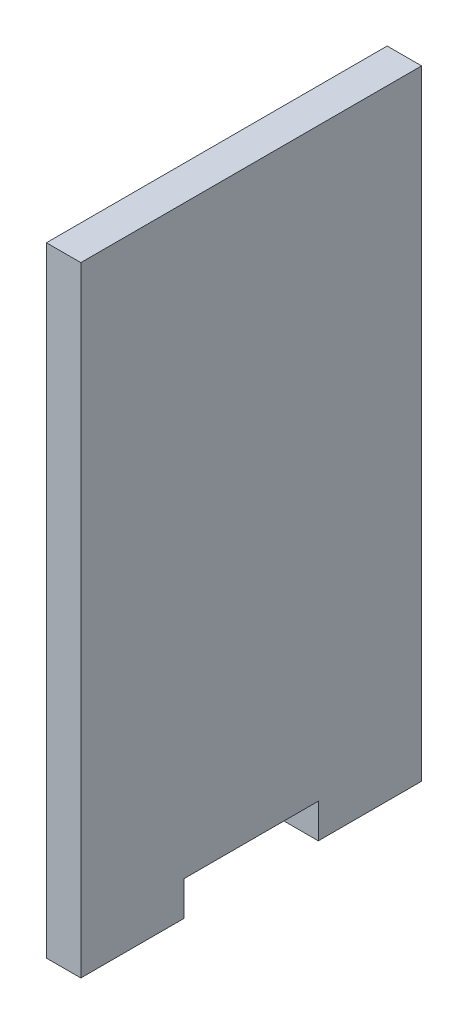
ISO-10303-21;
HEADER;
FILE_DESCRIPTION(('STEP AP214'),'2;1');
FILE_NAME('part.step','',(''),(''),'','','');
FILE_SCHEMA(('AUTOMOTIVE_DESIGN { 1 0 10303 214 1 1 1 1 }'));
ENDSEC;
DATA;
#1=APPLICATION_CONTEXT('core data for automotive mechanical design processes');
#2=APPLICATION_PROTOCOL_DEFINITION('international standard','automotive_design',2000,#1);
#3=PRODUCT_CONTEXT('',#1,'mechanical');
#4=PRODUCT('Part','Part','',(#3));
#5=PRODUCT_RELATED_PRODUCT_CATEGORY('part','',(#4));
#6=PRODUCT_DEFINITION_FORMATION('','',#4);
#7=PRODUCT_DEFINITION_CONTEXT('part definition',#1,'design');
#8=PRODUCT_DEFINITION('design','',#6,#7);
#9=PRODUCT_DEFINITION_SHAPE('','',#8);
#10=(LENGTH_UNIT() NAMED_UNIT(*) SI_UNIT(.MILLI.,.METRE.));
#11=(NAMED_UNIT(*) PLANE_ANGLE_UNIT() SI_UNIT($,.RADIAN.));
#12=(NAMED_UNIT(*) SI_UNIT($,.STERADIAN.) SOLID_ANGLE_UNIT());
#13=UNCERTAINTY_MEASURE_WITH_UNIT(LENGTH_MEASURE(1.E-05),#10,'distance_accuracy_value','');
#14=(GEOMETRIC_REPRESENTATION_CONTEXT(3) GLOBAL_UNCERTAINTY_ASSIGNED_CONTEXT((#13)) GLOBAL_UNIT_ASSIGNED_CONTEXT((#10,
#11,#12)) REPRESENTATION_CONTEXT('',''));
#15=CARTESIAN_POINT('',(0.,0.,0.));
#16=DIRECTION('',(0.,0.,1.));
#17=DIRECTION('',(1.,0.,0.));
#18=AXIS2_PLACEMENT_3D('',#15,#16,#17);
#19=CARTESIAN_POINT('',(5.,43.2670104469725,0.));
#20=DIRECTION('',(0.,0.,-1.));
#21=DIRECTION('',(0.,1.,0.));
#22=AXIS2_PLACEMENT_3D('',#19,#20,#21);
#23=PLANE('',#22);
#24=DIRECTION('',(0.,-1.,0.));
#25=VECTOR('',#24,1.);
#26=CARTESIAN_POINT('',(0.,43.2670104469725,0.));
#27=LINE('',#26,#25);
#28=CARTESIAN_POINT('',(0.,43.2670104469725,0.));
#29=VERTEX_POINT('',#28);
#30=CARTESIAN_POINT('',(0.,-46.7329895530275,0.));
#31=VERTEX_POINT('',#30);
#32=EDGE_CURVE('E103',#29,#31,#27,.T.);
#33=ORIENTED_EDGE('',*,*,#32,.T.);
#34=DIRECTION('',(1.,0.,0.));
#35=VECTOR('',#34,1.);
#36=CARTESIAN_POINT('',(0.,-46.7329895530275,0.));
#37=LINE('',#36,#35);
#38=CARTESIAN_POINT('',(5.,-46.7329895530275,0.));
#39=VERTEX_POINT('',#38);
#40=EDGE_CURVE('E106',#31,#39,#37,.T.);
#41=ORIENTED_EDGE('',*,*,#40,.T.);
#42=DIRECTION('',(0.,-1.,0.));
#43=VECTOR('',#42,1.);
#44=CARTESIAN_POINT('',(5.,43.2670104469725,0.));
#45=LINE('',#44,#43);
#46=CARTESIAN_POINT('',(5.,43.2670104469725,0.));
#47=VERTEX_POINT('',#46);
#48=EDGE_CURVE('E151',#47,#39,#45,.T.);
#49=ORIENTED_EDGE('',*,*,#48,.F.);
#50=DIRECTION('',(-1.,0.,0.));
#51=VECTOR('',#50,1.);
#52=CARTESIAN_POINT('',(5.,43.2670104469725,0.));
#53=LINE('',#52,#51);
#54=EDGE_CURVE('E44',#47,#29,#53,.T.);
#55=ORIENTED_EDGE('',*,*,#54,.T.);
#56=EDGE_LOOP('',(#33,#41,#49,#55));
#57=FACE_BOUND('',#56,.T.);
#58=ADVANCED_FACE('F35',(#57),#23,.F.);
#59=CARTESIAN_POINT('',(5.,-41.7329895530275,0.));
#60=DIRECTION('',(0.,1.,0.));
#61=DIRECTION('',(0.,0.,1.));
#62=AXIS2_PLACEMENT_3D('',#59,#60,#61);
#63=PLANE('',#62);
#64=DIRECTION('',(0.,0.,-1.));
#65=VECTOR('',#64,1.);
#66=CARTESIAN_POINT('',(5.,-41.7329895530275,0.));
#67=LINE('',#66,#65);
#68=CARTESIAN_POINT('',(5.,-41.7329895530275,-15.));
#69=VERTEX_POINT('',#68);
#70=CARTESIAN_POINT('',(5.,-41.7329895530275,-34.5));
#71=VERTEX_POINT('',#70);
#72=EDGE_CURVE('E38',#69,#71,#67,.T.);
#73=ORIENTED_EDGE('',*,*,#72,.F.);
#74=DIRECTION('',(1.,0.,0.));
#75=VECTOR('',#74,1.);
#76=CARTESIAN_POINT('',(0.,-41.7329895530275,-15.));
#77=LINE('',#76,#75);
#78=CARTESIAN_POINT('',(0.,-41.7329895530275,-15.));
#79=VERTEX_POINT('',#78);
#80=EDGE_CURVE('E133',#79,#69,#77,.T.);
#81=ORIENTED_EDGE('',*,*,#80,.F.);
#82=DIRECTION('',(0.,0.,-1.));
#83=VECTOR('',#82,1.);
#84=CARTESIAN_POINT('',(0.,-41.7329895530275,0.));
#85=LINE('',#84,#83);
#86=CARTESIAN_POINT('',(0.,-41.7329895530275,-34.5));
#87=VERTEX_POINT('',#86);
#88=EDGE_CURVE('E112',#79,#87,#85,.T.);
#89=ORIENTED_EDGE('',*,*,#88,.T.);
#90=DIRECTION('',(1.,0.,0.));
#91=VECTOR('',#90,1.);
#92=CARTESIAN_POINT('',(0.,-41.7329895530275,-34.5));
#93=LINE('',#92,#91);
#94=EDGE_CURVE('E140',#87,#71,#93,.T.);
#95=ORIENTED_EDGE('',*,*,#94,.T.);
#96=EDGE_LOOP('',(#73,#81,#89,#95));
#97=FACE_BOUND('',#96,.T.);
#98=ADVANCED_FACE('F188',(#97),#63,.F.);
#99=CARTESIAN_POINT('',(5.,43.2670104469725,-49.5));
#100=DIRECTION('',(0.,0.,1.));
#101=DIRECTION('',(0.,-1.,0.));
#102=AXIS2_PLACEMENT_3D('',#99,#100,#101);
#103=PLANE('',#102);
#104=DIRECTION('',(0.,1.,0.));
#105=VECTOR('',#104,1.);
#106=CARTESIAN_POINT('',(0.,43.2670104469725,-49.5));
#107=LINE('',#106,#105);
#108=CARTESIAN_POINT('',(0.,-46.7329895530275,-49.5));
#109=VERTEX_POINT('',#108);
#110=CARTESIAN_POINT('',(0.,43.2670104469725,-49.5));
#111=VERTEX_POINT('',#110);
#112=EDGE_CURVE('E161',#109,#111,#107,.T.);
#113=ORIENTED_EDGE('',*,*,#112,.T.);
#114=DIRECTION('',(-1.,0.,0.));
#115=VECTOR('',#114,1.);
#116=CARTESIAN_POINT('',(5.,43.2670104469725,-49.5));
#117=LINE('',#116,#115);
#118=CARTESIAN_POINT('',(5.,43.2670104469725,-49.5));
#119=VERTEX_POINT('',#118);
#120=EDGE_CURVE('E11',#119,#111,#117,.T.);
#121=ORIENTED_EDGE('',*,*,#120,.F.);
#122=DIRECTION('',(0.,1.,0.));
#123=VECTOR('',#122,1.);
#124=CARTESIAN_POINT('',(5.,43.2670104469725,-49.5));
#125=LINE('',#124,#123);
#126=CARTESIAN_POINT('',(5.,-46.7329895530275,-49.5));
#127=VERTEX_POINT('',#126);
#128=EDGE_CURVE('E180',#127,#119,#125,.T.);
#129=ORIENTED_EDGE('',*,*,#128,.F.);
#130=DIRECTION('',(1.,0.,0.));
#131=VECTOR('',#130,1.);
#132=CARTESIAN_POINT('',(0.,-46.7329895530275,-49.5));
#133=LINE('',#132,#131);
#134=EDGE_CURVE('E113',#109,#127,#133,.T.);
#135=ORIENTED_EDGE('',*,*,#134,.F.);
#136=EDGE_LOOP('',(#113,#121,#129,#135));
#137=FACE_BOUND('',#136,.T.);
#138=ADVANCED_FACE('F178',(#137),#103,.F.);
#139=CARTESIAN_POINT('',(5.,43.2670104469725,0.));
#140=DIRECTION('',(0.,-1.,0.));
#141=DIRECTION('',(0.,0.,-1.));
#142=AXIS2_PLACEMENT_3D('',#139,#140,#141);
#143=PLANE('',#142);
#144=DIRECTION('',(0.,0.,1.));
#145=VECTOR('',#144,1.);
#146=CARTESIAN_POINT('',(0.,43.2670104469725,0.));
#147=LINE('',#146,#145);
#148=EDGE_CURVE('E166',#111,#29,#147,.T.);
#149=ORIENTED_EDGE('',*,*,#148,.T.);
#150=ORIENTED_EDGE('',*,*,#54,.F.);
#151=DIRECTION('',(0.,0.,1.));
#152=VECTOR('',#151,1.);
#153=CARTESIAN_POINT('',(5.,43.2670104469725,0.));
#154=LINE('',#153,#152);
#155=EDGE_CURVE('E168',#119,#47,#154,.T.);
#156=ORIENTED_EDGE('',*,*,#155,.F.);
#157=ORIENTED_EDGE('',*,*,#120,.T.);
#158=EDGE_LOOP('',(#149,#150,#156,#157));
#159=FACE_BOUND('',#158,.T.);
#160=ADVANCED_FACE('F185',(#159),#143,.F.);
#161=CARTESIAN_POINT('',(5.,0.,0.));
#162=DIRECTION('',(1.,0.,0.));
#163=DIRECTION('',(0.,0.,-1.));
#164=AXIS2_PLACEMENT_3D('',#161,#162,#163);
#165=PLANE('',#164);
#166=ORIENTED_EDGE('',*,*,#48,.T.);
#167=DIRECTION('',(0.,0.,-1.));
#168=VECTOR('',#167,1.);
#169=CARTESIAN_POINT('',(5.,-46.7329895530275,0.));
#170=LINE('',#169,#168);
#171=CARTESIAN_POINT('',(5.,-46.7329895530275,-15.));
#172=VERTEX_POINT('',#171);
#173=EDGE_CURVE('E120',#39,#172,#170,.T.);
#174=ORIENTED_EDGE('',*,*,#173,.T.);
#175=DIRECTION('',(0.,1.,0.));
#176=VECTOR('',#175,1.);
#177=CARTESIAN_POINT('',(5.,-41.7329895530275,-15.));
#178=LINE('',#177,#176);
#179=EDGE_CURVE('E127',#172,#69,#178,.T.);
#180=ORIENTED_EDGE('',*,*,#179,.T.);
#181=ORIENTED_EDGE('',*,*,#72,.T.);
#182=DIRECTION('',(0.,-1.,0.));
#183=VECTOR('',#182,1.);
#184=CARTESIAN_POINT('',(5.,-41.7329895530275,-34.5));
#185=LINE('',#184,#183);
#186=CARTESIAN_POINT('',(5.,-46.7329895530275,-34.5));
#187=VERTEX_POINT('',#186);
#188=EDGE_CURVE('E135',#71,#187,#185,.T.);
#189=ORIENTED_EDGE('',*,*,#188,.T.);
#190=DIRECTION('',(0.,0.,-1.));
#191=VECTOR('',#190,1.);
#192=CARTESIAN_POINT('',(5.,-46.7329895530275,-49.5));
#193=LINE('',#192,#191);
#194=EDGE_CURVE('E142',#187,#127,#193,.T.);
#195=ORIENTED_EDGE('',*,*,#194,.T.);
#196=ORIENTED_EDGE('',*,*,#128,.T.);
#197=ORIENTED_EDGE('',*,*,#155,.T.);
#198=EDGE_LOOP('',(#166,#174,#180,#181,#189,#195,#196,#197));
#199=FACE_BOUND('',#198,.T.);
#200=ADVANCED_FACE('F170',(#199),#165,.T.);
#201=CARTESIAN_POINT('',(0.,0.,0.));
#202=DIRECTION('',(1.,0.,0.));
#203=DIRECTION('',(0.,0.,-1.));
#204=AXIS2_PLACEMENT_3D('',#201,#202,#203);
#205=PLANE('',#204);
#206=ORIENTED_EDGE('',*,*,#32,.F.);
#207=ORIENTED_EDGE('',*,*,#148,.F.);
#208=ORIENTED_EDGE('',*,*,#112,.F.);
#209=DIRECTION('',(0.,0.,-1.));
#210=VECTOR('',#209,1.);
#211=CARTESIAN_POINT('',(0.,-46.7329895530275,-49.5));
#212=LINE('',#211,#210);
#213=CARTESIAN_POINT('',(0.,-46.7329895530275,-34.5));
#214=VERTEX_POINT('',#213);
#215=EDGE_CURVE('E137',#214,#109,#212,.T.);
#216=ORIENTED_EDGE('',*,*,#215,.F.);
#217=DIRECTION('',(0.,-1.,0.));
#218=VECTOR('',#217,1.);
#219=CARTESIAN_POINT('',(0.,-41.7329895530275,-34.5));
#220=LINE('',#219,#218);
#221=EDGE_CURVE('E141',#87,#214,#220,.T.);
#222=ORIENTED_EDGE('',*,*,#221,.F.);
#223=ORIENTED_EDGE('',*,*,#88,.F.);
#224=DIRECTION('',(0.,1.,0.));
#225=VECTOR('',#224,1.);
#226=CARTESIAN_POINT('',(0.,-41.7329895530275,-15.));
#227=LINE('',#226,#225);
#228=CARTESIAN_POINT('',(0.,-46.7329895530275,-15.));
#229=VERTEX_POINT('',#228);
#230=EDGE_CURVE('E122',#229,#79,#227,.T.);
#231=ORIENTED_EDGE('',*,*,#230,.F.);
#232=DIRECTION('',(0.,0.,-1.));
#233=VECTOR('',#232,1.);
#234=CARTESIAN_POINT('',(0.,-46.7329895530275,0.));
#235=LINE('',#234,#233);
#236=EDGE_CURVE('E118',#31,#229,#235,.T.);
#237=ORIENTED_EDGE('',*,*,#236,.F.);
#238=EDGE_LOOP('',(#206,#207,#208,#216,#222,#223,#231,#237));
#239=FACE_BOUND('',#238,.T.);
#240=ADVANCED_FACE('F125',(#239),#205,.F.);
#241=CARTESIAN_POINT('',(0.,-46.7329895530275,-49.5));
#242=DIRECTION('',(0.,-1.,0.));
#243=DIRECTION('',(0.,0.,-1.));
#244=AXIS2_PLACEMENT_3D('',#241,#242,#243);
#245=PLANE('',#244);
#246=ORIENTED_EDGE('',*,*,#194,.F.);
#247=DIRECTION('',(1.,0.,0.));
#248=VECTOR('',#247,1.);
#249=CARTESIAN_POINT('',(0.,-46.7329895530275,-34.5));
#250=LINE('',#249,#248);
#251=EDGE_CURVE('E147',#214,#187,#250,.T.);
#252=ORIENTED_EDGE('',*,*,#251,.F.);
#253=ORIENTED_EDGE('',*,*,#215,.T.);
#254=ORIENTED_EDGE('',*,*,#134,.T.);
#255=EDGE_LOOP('',(#246,#252,#253,#254));
#256=FACE_BOUND('',#255,.T.);
#257=ADVANCED_FACE('F174',(#256),#245,.T.);
#258=CARTESIAN_POINT('',(0.,-41.7329895530275,-34.5));
#259=DIRECTION('',(0.,0.,1.));
#260=DIRECTION('',(1.,0.,0.));
#261=AXIS2_PLACEMENT_3D('',#258,#259,#260);
#262=PLANE('',#261);
#263=ORIENTED_EDGE('',*,*,#188,.F.);
#264=ORIENTED_EDGE('',*,*,#94,.F.);
#265=ORIENTED_EDGE('',*,*,#221,.T.);
#266=ORIENTED_EDGE('',*,*,#251,.T.);
#267=EDGE_LOOP('',(#263,#264,#265,#266));
#268=FACE_BOUND('',#267,.T.);
#269=ADVANCED_FACE('F187',(#268),#262,.T.);
#270=CARTESIAN_POINT('',(0.,-41.7329895530275,-15.));
#271=DIRECTION('',(0.,0.,-1.));
#272=DIRECTION('',(-1.,0.,0.));
#273=AXIS2_PLACEMENT_3D('',#270,#271,#272);
#274=PLANE('',#273);
#275=ORIENTED_EDGE('',*,*,#179,.F.);
#276=DIRECTION('',(1.,0.,0.));
#277=VECTOR('',#276,1.);
#278=CARTESIAN_POINT('',(0.,-46.7329895530275,-15.));
#279=LINE('',#278,#277);
#280=EDGE_CURVE('E121',#229,#172,#279,.T.);
#281=ORIENTED_EDGE('',*,*,#280,.F.);
#282=ORIENTED_EDGE('',*,*,#230,.T.);
#283=ORIENTED_EDGE('',*,*,#80,.T.);
#284=EDGE_LOOP('',(#275,#281,#282,#283));
#285=FACE_BOUND('',#284,.T.);
#286=ADVANCED_FACE('F191',(#285),#274,.T.);
#287=CARTESIAN_POINT('',(0.,-46.7329895530275,0.));
#288=DIRECTION('',(0.,-1.,0.));
#289=DIRECTION('',(0.,0.,-1.));
#290=AXIS2_PLACEMENT_3D('',#287,#288,#289);
#291=PLANE('',#290);
#292=ORIENTED_EDGE('',*,*,#173,.F.);
#293=ORIENTED_EDGE('',*,*,#40,.F.);
#294=ORIENTED_EDGE('',*,*,#236,.T.);
#295=ORIENTED_EDGE('',*,*,#280,.T.);
#296=EDGE_LOOP('',(#292,#293,#294,#295));
#297=FACE_BOUND('',#296,.T.);
#298=ADVANCED_FACE('F117',(#297),#291,.T.);
#299=CLOSED_SHELL('',(#58,#98,#138,#160,#200,#240,#257,#269,#286,#298));
#300=MANIFOLD_SOLID_BREP('B2',#299);
#301=ADVANCED_BREP_SHAPE_REPRESENTATION('',(#18,#300),#14);
#302=SHAPE_DEFINITION_REPRESENTATION(#9,#301);
ENDSEC;
END-ISO-10303-21;
